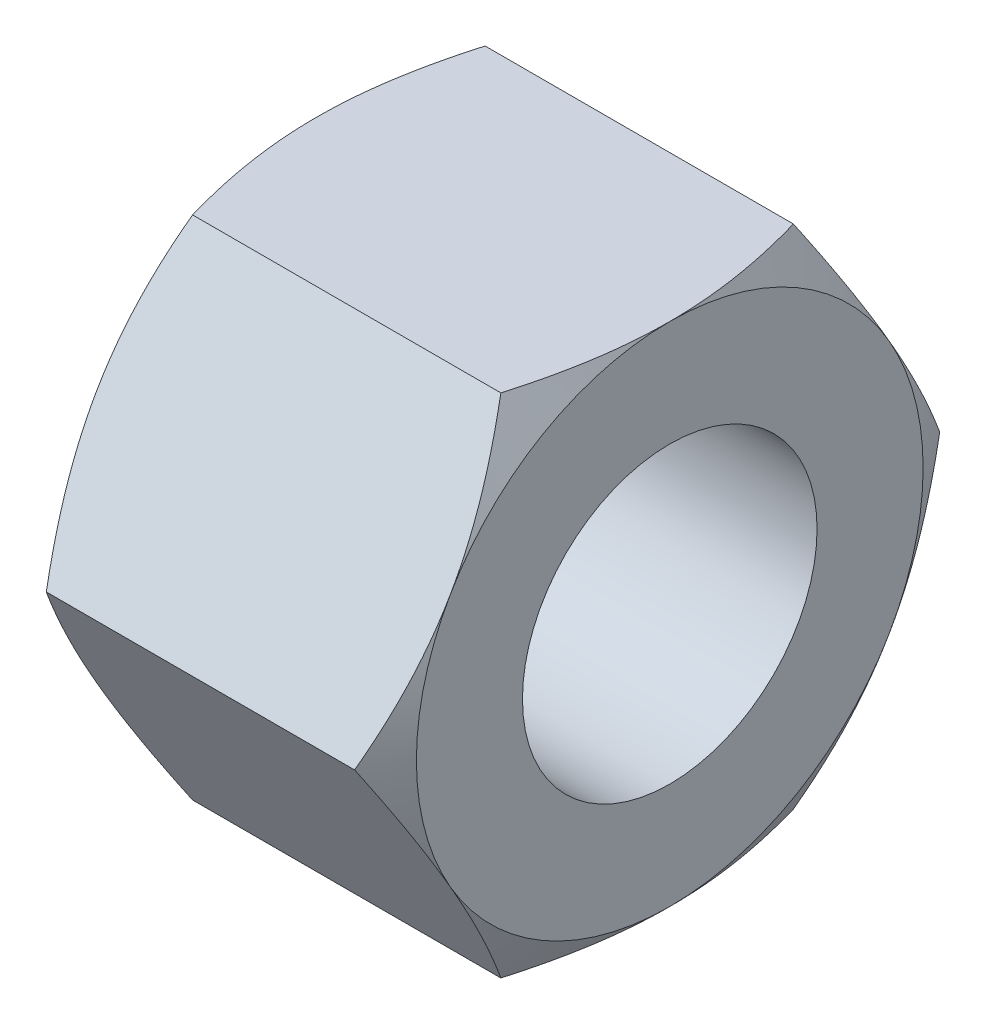
ISO-10303-21;
HEADER;
FILE_DESCRIPTION(('STEP AP214'),'2;1');
FILE_NAME('part.step','',(''),(''),'','','');
FILE_SCHEMA(('AUTOMOTIVE_DESIGN { 1 0 10303 214 1 1 1 1 }'));
ENDSEC;
DATA;
#1=APPLICATION_CONTEXT('core data for automotive mechanical design processes');
#2=APPLICATION_PROTOCOL_DEFINITION('international standard','automotive_design',2000,#1);
#3=PRODUCT_CONTEXT('',#1,'mechanical');
#4=PRODUCT('Part','Part','',(#3));
#5=PRODUCT_RELATED_PRODUCT_CATEGORY('part','',(#4));
#6=PRODUCT_DEFINITION_FORMATION('','',#4);
#7=PRODUCT_DEFINITION_CONTEXT('part definition',#1,'design');
#8=PRODUCT_DEFINITION('design','',#6,#7);
#9=PRODUCT_DEFINITION_SHAPE('','',#8);
#10=(LENGTH_UNIT() NAMED_UNIT(*) SI_UNIT(.MILLI.,.METRE.));
#11=(NAMED_UNIT(*) PLANE_ANGLE_UNIT() SI_UNIT($,.RADIAN.));
#12=(NAMED_UNIT(*) SI_UNIT($,.STERADIAN.) SOLID_ANGLE_UNIT());
#13=UNCERTAINTY_MEASURE_WITH_UNIT(LENGTH_MEASURE(1.E-05),#10,'distance_accuracy_value','');
#14=(GEOMETRIC_REPRESENTATION_CONTEXT(3) GLOBAL_UNCERTAINTY_ASSIGNED_CONTEXT((#13)) GLOBAL_UNIT_ASSIGNED_CONTEXT((#10,
#11,#12)) REPRESENTATION_CONTEXT('',''));
#15=CARTESIAN_POINT('',(0.,0.,0.));
#16=DIRECTION('',(0.,0.,1.));
#17=DIRECTION('',(1.,0.,0.));
#18=AXIS2_PLACEMENT_3D('',#15,#16,#17);
#19=CARTESIAN_POINT('',(3.,-2.14999999999999,-1.24130307875772));
#20=DIRECTION('',(0.,0.499999999999995,0.866025403784441));
#21=DIRECTION('',(0.,-0.866025403784442,0.499999999999995));
#22=AXIS2_PLACEMENT_3D('',#19,#20,#21);
#23=PLANE('',#22);
#24=CARTESIAN_POINT('',(0.192096925893251,0.0002,-2.48272162756923));
#25=CARTESIAN_POINT('',(0.160589161253283,-0.0942828544477714,-2.42817192612001));
#26=CARTESIAN_POINT('',(0.131933662025594,-0.189581276095229,-2.3731513567285));
#27=CARTESIAN_POINT('',(0.0819144293305165,-0.381828422928351,-2.26215741475346));
#28=CARTESIAN_POINT('',(0.0605683921605976,-0.478780564899942,-2.20618206948765));
#29=CARTESIAN_POINT('',(0.0273391201969649,-0.671483268180891,-2.09492511187483));
#30=CARTESIAN_POINT('',(0.0152347449233589,-0.7672041742709,-2.03966062097669));
#31=CARTESIAN_POINT('',(0.000782809472607443,-0.959096546668927,-1.92887150811725));
#32=CARTESIAN_POINT('',(-0.00157671621943161,-1.05526731517428,-1.87334728903251));
#33=CARTESIAN_POINT('',(0.00332342050458356,-1.23497844012888,-1.76959102266361));
#34=CARTESIAN_POINT('',(0.00937993057849274,-1.31854565443535,-1.72134346898834));
#35=CARTESIAN_POINT('',(0.0285781524174342,-1.48513562507559,-1.62516270459491));
#36=CARTESIAN_POINT('',(0.0417264267478165,-1.56815780490605,-1.57722982672108));
#37=CARTESIAN_POINT('',(0.0745971339559549,-1.73509144705124,-1.48085064349176));
#38=CARTESIAN_POINT('',(0.0944589497722667,-1.81898177370144,-1.43241654081785));
#39=CARTESIAN_POINT('',(0.139537859693889,-1.98551098840158,-1.33627085388279));
#40=CARTESIAN_POINT('',(0.164744356993194,-2.06815201109882,-1.28855803718244));
#41=CARTESIAN_POINT('',(0.192096925893251,-2.15019999999999,-1.24118760870388));
#42=B_SPLINE_CURVE_WITH_KNOTS('',3,(#24,#25,#26,#27,#28,#29,#30,#31,#32,#33,#34,#35,#36,#37,#38,
#39,#40,#41),.UNSPECIFIED.,.F.,.F.,(4,2,2,2,2,2,2,2,4),(0.,0.340808025484725,0.682435412466171,
1.01560703788048,1.34836944636288,1.63814855640103,1.92819628298639,2.22467903177776,
2.52057935603964),.UNSPECIFIED.);
#43=CARTESIAN_POINT('',(0.192030254575638,0.,-2.48260615751539));
#44=VERTEX_POINT('',#43);
#45=CARTESIAN_POINT('',(0.,-1.07499999999999,-1.86195461813655));
#46=VERTEX_POINT('',#45);
#47=EDGE_CURVE('E157',#44,#46,#42,.T.);
#48=ORIENTED_EDGE('',*,*,#47,.F.);
#49=DIRECTION('',(-1.,0.,0.));
#50=VECTOR('',#49,1.);
#51=CARTESIAN_POINT('',(3.,0.,-2.48260615751539));
#52=LINE('',#51,#50);
#53=CARTESIAN_POINT('',(2.80796974542436,0.,-2.48260615751539));
#54=VERTEX_POINT('',#53);
#55=EDGE_CURVE('E170',#54,#44,#52,.T.);
#56=ORIENTED_EDGE('',*,*,#55,.F.);
#57=CARTESIAN_POINT('',(2.80790307410675,-2.15019999999999,-1.24118760870388));
#58=CARTESIAN_POINT('',(2.83941083874672,-2.05571714555222,-1.29573731015311));
#59=CARTESIAN_POINT('',(2.86806633797441,-1.96041872390476,-1.35075787954461));
#60=CARTESIAN_POINT('',(2.91808557066948,-1.76817157707164,-1.46175182151965));
#61=CARTESIAN_POINT('',(2.9394316078394,-1.67121943510004,-1.51772716678546));
#62=CARTESIAN_POINT('',(2.97266087980303,-1.4785167318191,-1.62898412439828));
#63=CARTESIAN_POINT('',(2.98476525507664,-1.38279582572909,-1.68424861529642));
#64=CARTESIAN_POINT('',(2.99921719052739,-1.19090345333106,-1.79503772815586));
#65=CARTESIAN_POINT('',(3.00157671621943,-1.0947326848257,-1.8505619472406));
#66=CARTESIAN_POINT('',(2.99667657949542,-0.915021559871109,-1.9543182136095));
#67=CARTESIAN_POINT('',(2.99062006942151,-0.831454345564637,-2.00256576728477));
#68=CARTESIAN_POINT('',(2.97142184758257,-0.664864374924398,-2.0987465316782));
#69=CARTESIAN_POINT('',(2.95827357325218,-0.581842195093935,-2.14667940955203));
#70=CARTESIAN_POINT('',(2.92540286604404,-0.41490855294875,-2.24305859278136));
#71=CARTESIAN_POINT('',(2.90554105022773,-0.331018226298543,-2.29149269545526));
#72=CARTESIAN_POINT('',(2.86046214030611,-0.164489011598404,-2.38763838239032));
#73=CARTESIAN_POINT('',(2.83525564300681,-0.0818479889011668,-2.43535119909067));
#74=CARTESIAN_POINT('',(2.80790307410675,0.000199999999999887,-2.48272162756923));
#75=B_SPLINE_CURVE_WITH_KNOTS('',3,(#57,#58,#59,#60,#61,#62,#63,#64,#65,#66,#67,#68,#69,#70,#71,
#72,#73,#74),.UNSPECIFIED.,.F.,.F.,(4,2,2,2,2,2,2,2,4),(0.,0.340808025484725,0.682435412466171,
1.01560703788048,1.34836944636288,1.63814855640103,1.92819628298639,2.22467903177776,
2.52057935603964),.UNSPECIFIED.);
#76=CARTESIAN_POINT('',(3.,-1.07499999999999,-1.86195461813656));
#77=VERTEX_POINT('',#76);
#78=EDGE_CURVE('E350',#77,#54,#75,.T.);
#79=ORIENTED_EDGE('',*,*,#78,.F.);
#80=CARTESIAN_POINT('',(2.8079697454251,-2.14999999999999,-1.24130307875881));
#81=VERTEX_POINT('',#80);
#82=EDGE_CURVE('E339',#81,#77,#75,.T.);
#83=ORIENTED_EDGE('',*,*,#82,.F.);
#84=DIRECTION('',(-1.,0.,0.));
#85=VECTOR('',#84,1.);
#86=CARTESIAN_POINT('',(3.,-2.14999999999999,-1.24130307875772));
#87=LINE('',#86,#85);
#88=CARTESIAN_POINT('',(0.192030254575638,-2.14999999999999,-1.24130307875772));
#89=VERTEX_POINT('',#88);
#90=EDGE_CURVE('E265',#81,#89,#87,.T.);
#91=ORIENTED_EDGE('',*,*,#90,.T.);
#92=EDGE_CURVE('E223',#46,#89,#42,.T.);
#93=ORIENTED_EDGE('',*,*,#92,.F.);
#94=EDGE_LOOP('',(#48,#56,#79,#83,#91,#93));
#95=FACE_BOUND('',#94,.T.);
#96=ADVANCED_FACE('F47',(#95),#23,.F.);
#97=CARTESIAN_POINT('',(3.,0.,-2.48260615751539));
#98=DIRECTION('',(0.,-0.500000000000001,0.866025403784438));
#99=DIRECTION('',(0.,-0.866025403784438,-0.500000000000001));
#100=AXIS2_PLACEMENT_3D('',#97,#98,#99);
#101=PLANE('',#100);
#102=CARTESIAN_POINT('',(0.192096925893251,2.1502,-1.24118760870385));
#103=CARTESIAN_POINT('',(0.160589161253282,2.05571714555223,-1.29573731015308));
#104=CARTESIAN_POINT('',(0.131933662025594,1.96041872390478,-1.35075787954458));
#105=CARTESIAN_POINT('',(0.0819144293305153,1.76817157707166,-1.46175182151962));
#106=CARTESIAN_POINT('',(0.060568392160596,1.67121943510006,-1.51772716678543));
#107=CARTESIAN_POINT('',(0.0273391201969623,1.47851673181912,-1.62898412439826));
#108=CARTESIAN_POINT('',(0.0152347449233555,1.38279582572911,-1.6842486152964));
#109=CARTESIAN_POINT('',(0.000782809472603016,1.19090345333108,-1.79503772815584));
#110=CARTESIAN_POINT('',(-0.00157671621943646,1.09473268482573,-1.85056194724058));
#111=CARTESIAN_POINT('',(0.003323420504578,0.91502155987113,-1.95431821360948));
#112=CARTESIAN_POINT('',(0.00937993057848707,0.831454345564656,-2.00256576728475));
#113=CARTESIAN_POINT('',(0.0285781524174287,0.664864374924414,-2.09874653167819));
#114=CARTESIAN_POINT('',(0.0417264267478113,0.581842195093949,-2.14667940955202));
#115=CARTESIAN_POINT('',(0.0745971339559506,0.41490855294876,-2.24305859278135));
#116=CARTESIAN_POINT('',(0.094458949772263,0.33101822629855,-2.29149269545525));
#117=CARTESIAN_POINT('',(0.139537859693887,0.164489011598408,-2.38763838239032));
#118=CARTESIAN_POINT('',(0.164744356993193,0.0818479889011682,-2.43535119909067));
#119=CARTESIAN_POINT('',(0.192096925893251,-0.00020000000000019,-2.48272162756923));
#120=B_SPLINE_CURVE_WITH_KNOTS('',3,(#102,#103,#104,#105,#106,#107,#108,#109,#110,#111,#112,
#113,#114,#115,#116,#117,#118,#119),.UNSPECIFIED.,.F.,.F.,(4,2,2,2,2,2,2,2,4),(0.,
0.340808025484724,0.682435412466171,1.01560703788048,1.34836944636288,1.63814855640104,
1.92819628298641,2.22467903177778,2.52057935603967),.UNSPECIFIED.);
#121=CARTESIAN_POINT('',(0.192030254575638,2.15,-1.24130307875769));
#122=VERTEX_POINT('',#121);
#123=CARTESIAN_POINT('',(0.,1.075,-1.86195461813654));
#124=VERTEX_POINT('',#123);
#125=EDGE_CURVE('E137',#122,#124,#120,.T.);
#126=ORIENTED_EDGE('',*,*,#125,.F.);
#127=DIRECTION('',(-1.,0.,0.));
#128=VECTOR('',#127,1.);
#129=CARTESIAN_POINT('',(3.,2.15,-1.24130307875769));
#130=LINE('',#129,#128);
#131=CARTESIAN_POINT('',(2.80796974542436,2.15,-1.24130307875769));
#132=VERTEX_POINT('',#131);
#133=EDGE_CURVE('E262',#132,#122,#130,.T.);
#134=ORIENTED_EDGE('',*,*,#133,.F.);
#135=CARTESIAN_POINT('',(2.80790307410675,-0.000200000000000046,-2.48272162756923));
#136=CARTESIAN_POINT('',(2.83941083874672,0.0942828544477709,-2.42817192612001));
#137=CARTESIAN_POINT('',(2.86806633797441,0.189581276095228,-2.3731513567285));
#138=CARTESIAN_POINT('',(2.91808557066948,0.381828422928349,-2.26215741475346));
#139=CARTESIAN_POINT('',(2.9394316078394,0.478780564899939,-2.20618206948765));
#140=CARTESIAN_POINT('',(2.97266087980304,0.671483268180888,-2.09492511187483));
#141=CARTESIAN_POINT('',(2.98476525507664,0.767204174270896,-2.03966062097669));
#142=CARTESIAN_POINT('',(2.9992171905274,0.959096546668922,-1.92887150811725));
#143=CARTESIAN_POINT('',(3.00157671621944,1.05526731517428,-1.87334728903251));
#144=CARTESIAN_POINT('',(2.99667657949542,1.23497844012887,-1.7695910226636));
#145=CARTESIAN_POINT('',(2.99062006942151,1.31854565443535,-1.72134346898833));
#146=CARTESIAN_POINT('',(2.97142184758257,1.48513562507559,-1.6251627045949));
#147=CARTESIAN_POINT('',(2.95827357325219,1.56815780490606,-1.57722982672107));
#148=CARTESIAN_POINT('',(2.92540286604405,1.73509144705124,-1.48085064349174));
#149=CARTESIAN_POINT('',(2.90554105022774,1.81898177370145,-1.43241654081783));
#150=CARTESIAN_POINT('',(2.86046214030611,1.9855109884016,-1.33627085388277));
#151=CARTESIAN_POINT('',(2.83525564300681,2.06815201109884,-1.28855803718241));
#152=CARTESIAN_POINT('',(2.80790307410675,2.1502,-1.24118760870385));
#153=B_SPLINE_CURVE_WITH_KNOTS('',3,(#135,#136,#137,#138,#139,#140,#141,#142,#143,#144,#145,
#146,#147,#148,#149,#150,#151,#152),.UNSPECIFIED.,.F.,.F.,(4,2,2,2,2,2,2,2,4),(0.,
0.340808025484724,0.682435412466171,1.01560703788048,1.34836944636288,1.63814855640104,
1.92819628298641,2.22467903177778,2.52057935603967),.UNSPECIFIED.);
#154=CARTESIAN_POINT('',(3.,1.075,-1.86195461813654));
#155=VERTEX_POINT('',#154);
#156=EDGE_CURVE('E314',#155,#132,#153,.T.);
#157=ORIENTED_EDGE('',*,*,#156,.F.);
#158=EDGE_CURVE('E356',#54,#155,#153,.T.);
#159=ORIENTED_EDGE('',*,*,#158,.F.);
#160=ORIENTED_EDGE('',*,*,#55,.T.);
#161=EDGE_CURVE('E150',#124,#44,#120,.T.);
#162=ORIENTED_EDGE('',*,*,#161,.F.);
#163=EDGE_LOOP('',(#126,#134,#157,#159,#160,#162));
#164=FACE_BOUND('',#163,.T.);
#165=ADVANCED_FACE('F167',(#164),#101,.F.);
#166=CARTESIAN_POINT('',(3.,2.15,-1.24130307875769));
#167=DIRECTION('',(0.,-1.,0.));
#168=DIRECTION('',(0.,0.,-1.));
#169=AXIS2_PLACEMENT_3D('',#166,#167,#168);
#170=PLANE('',#169);
#171=CARTESIAN_POINT('',(1.97304082720904,2.14999999999998,5.13551557659761));
#172=CARTESIAN_POINT('',(1.9111978136608,2.14999999999998,5.01938751978212));
#173=CARTESIAN_POINT('',(1.84959388661399,2.14999999999998,4.90313272305725));
#174=CARTESIAN_POINT('',(1.72697575970478,2.14999999999998,4.67031149862428));
#175=CARTESIAN_POINT('',(1.665961564463,2.14999999999999,4.55374506848361));
#176=CARTESIAN_POINT('',(1.48384103932484,2.14999999999999,4.20324109640305));
#177=CARTESIAN_POINT('',(1.36379113122948,2.14999999999999,3.96875001202137));
#178=CARTESIAN_POINT('',(1.18383705796109,2.14999999999999,3.60904411221717));
#179=CARTESIAN_POINT('',(1.12235080546833,2.14999999999999,3.48462136005536));
#180=CARTESIAN_POINT('',(1.00096010135083,2.14999999999999,3.23500779711982));
#181=CARTESIAN_POINT('',(0.94105561419551,2.14999999999999,3.10981700367628));
#182=CARTESIAN_POINT('',(0.823335394707892,2.14999999999999,2.8585123096818));
#183=CARTESIAN_POINT('',(0.765518864800745,2.14999999999999,2.73239878422348));
#184=CARTESIAN_POINT('',(0.65264891502778,2.14999999999999,2.47894575735579));
#185=CARTESIAN_POINT('',(0.59759529935055,2.14999999999999,2.35160634359126));
#186=CARTESIAN_POINT('',(0.487153640528622,2.14999999999999,2.08552303397737));
#187=CARTESIAN_POINT('',(0.432064246359885,2.14999999999999,1.94665396448609));
#188=CARTESIAN_POINT('',(0.328060373356721,2.14999999999999,1.66664213248608));
#189=CARTESIAN_POINT('',(0.279143728185996,2.15,1.525500187366));
#190=CARTESIAN_POINT('',(0.190945483914671,2.15,1.2431159149578));
#191=CARTESIAN_POINT('',(0.15149868699877,2.15,1.10192630034479));
#192=CARTESIAN_POINT('',(0.084428327339249,2.15,0.816736754408399));
#193=CARTESIAN_POINT('',(0.0567981354084033,2.15,0.672738446317868));
#194=CARTESIAN_POINT('',(0.020463826511873,2.15,0.408660935346112));
#195=CARTESIAN_POINT('',(0.00925034624987716,2.15,0.288935284342623));
#196=CARTESIAN_POINT('',(-0.00159607014466984,2.15,0.0489864519840883));
#197=CARTESIAN_POINT('',(-0.00123341990284286,2.15,-0.0712365222763948));
#198=CARTESIAN_POINT('',(0.0111353515090182,2.15,-0.313204147053768));
#199=CARTESIAN_POINT('',(0.0233471789357867,2.15,-0.434938129891304));
#200=CARTESIAN_POINT('',(0.0495535256709606,2.15,-0.616352834193735));
#201=CARTESIAN_POINT('',(0.059607204159289,2.15,-0.676641450244351));
#202=CARTESIAN_POINT('',(0.0820923756868423,2.15,-0.79677017282907));
#203=CARTESIAN_POINT('',(0.0945237298383461,2.15,-0.85661030534848));
#204=CARTESIAN_POINT('',(0.15188984717885,2.15,-1.11011970307587));
#205=CARTESIAN_POINT('',(0.206947346628562,2.15,-1.30152357480082));
#206=CARTESIAN_POINT('',(0.300208918417984,2.15000000000001,-1.58501790053871));
#207=CARTESIAN_POINT('',(0.333108416249079,2.15000000000001,-1.67899380667504));
#208=CARTESIAN_POINT('',(0.40175338877044,2.15000000000001,-1.86590397338936));
#209=CARTESIAN_POINT('',(0.437498578956992,2.15000000000001,-1.9588383370405));
#210=CARTESIAN_POINT('',(0.548535557445448,2.15000000000001,-2.23748204208735));
#211=CARTESIAN_POINT('',(0.627215911804394,2.15000000000001,-2.42183067735492));
#212=CARTESIAN_POINT('',(0.790205035173104,2.15000000000001,-2.78783671960571));
#213=CARTESIAN_POINT('',(0.874510108907902,2.15000000000001,-2.96949579952417));
#214=CARTESIAN_POINT('',(1.04120457427137,2.15000000000001,-3.31904360015749));
#215=CARTESIAN_POINT('',(1.12335181593812,2.15000000000001,-3.48704835746746));
#216=CARTESIAN_POINT('',(1.28999448343906,2.15000000000001,-3.82192225231572));
#217=CARTESIAN_POINT('',(1.37449032930706,2.15000000000001,-3.98879117998764));
#218=CARTESIAN_POINT('',(1.54398995280402,2.15000000000001,-4.31934969091627));
#219=CARTESIAN_POINT('',(1.62897041638622,2.15000000000002,-4.48305126284176));
#220=CARTESIAN_POINT('',(1.80016880116636,2.15000000000002,-4.80975241634022));
#221=CARTESIAN_POINT('',(1.88638639478245,2.15000000000002,-4.97275216941171));
#222=CARTESIAN_POINT('',(1.97304082720904,2.15000000000002,-5.13551557659759));
#223=B_SPLINE_CURVE_WITH_KNOTS('',3,(#171,#172,#173,#174,#175,#176,#177,#178,#179,#180,#181,
#182,#183,#184,#185,#186,#187,#188,#189,#190,#191,#192,#193,#194,#195,#196,#197,#198,#199,#200,
#201,#202,#203,#204,#205,#206,#207,#208,#209,#210,#211,#212,#213,#214,#215,#216,#217,#218,#219,
#220,#221,#222),.UNSPECIFIED.,.F.,.F.,(4,2,2,2,2,2,2,2,2,2,2,2,2,2,2,2,2,2,2,2,2,2,2,2,2,4),(0.,
0.394704010920265,0.789411111892057,1.57967974830859,1.99603001095195,2.41237091331258,
2.8285510589567,3.24470166758592,3.69279283627303,4.14072630667059,4.58016108683166,
5.01934901699028,5.37958634547043,5.73968632808142,6.10615173432806,6.28947511358881,
6.47278778760703,7.06914896413799,7.36784667976661,7.6665145699135,8.26765607337328,
8.86840646110641,9.42941927258817,9.99053307175602,10.5438614714433,11.0970459633543),.UNSPECIFIED.);
#224=CARTESIAN_POINT('',(0.192030254575638,2.15,1.24130307875771));
#225=VERTEX_POINT('',#224);
#226=CARTESIAN_POINT('',(0.,2.15,0.));
#227=VERTEX_POINT('',#226);
#228=EDGE_CURVE('E64',#225,#227,#223,.T.);
#229=ORIENTED_EDGE('',*,*,#228,.F.);
#230=DIRECTION('',(-1.,0.,0.));
#231=VECTOR('',#230,1.);
#232=CARTESIAN_POINT('',(3.,2.15,1.24130307875771));
#233=LINE('',#232,#231);
#234=CARTESIAN_POINT('',(2.80796974542436,2.15,1.24130307875771));
#235=VERTEX_POINT('',#234);
#236=EDGE_CURVE('E257',#235,#225,#233,.T.);
#237=ORIENTED_EDGE('',*,*,#236,.F.);
#238=CARTESIAN_POINT('',(1.02695917279096,2.15000000000002,-5.1355155765976));
#239=CARTESIAN_POINT('',(1.0888021863392,2.15000000000002,-5.0193875197821));
#240=CARTESIAN_POINT('',(1.15040611338601,2.15000000000002,-4.90313272305724));
#241=CARTESIAN_POINT('',(1.27302424029522,2.15000000000002,-4.67031149862427));
#242=CARTESIAN_POINT('',(1.334038435537,2.15000000000002,-4.5537450684836));
#243=CARTESIAN_POINT('',(1.51615896067516,2.15000000000001,-4.20324109640304));
#244=CARTESIAN_POINT('',(1.63620886877052,2.15000000000001,-3.96875001202136));
#245=CARTESIAN_POINT('',(1.81616294203891,2.15000000000001,-3.60904411221715));
#246=CARTESIAN_POINT('',(1.87764919453167,2.15000000000001,-3.48462136005535));
#247=CARTESIAN_POINT('',(1.99903989864917,2.15000000000001,-3.23500779711981));
#248=CARTESIAN_POINT('',(2.05894438580449,2.15000000000001,-3.10981700367626));
#249=CARTESIAN_POINT('',(2.17666460529211,2.15000000000001,-2.85851230968179));
#250=CARTESIAN_POINT('',(2.23448113519926,2.15000000000001,-2.73239878422347));
#251=CARTESIAN_POINT('',(2.34735108497222,2.15000000000001,-2.47894575735578));
#252=CARTESIAN_POINT('',(2.40240470064945,2.15000000000001,-2.35160634359125));
#253=CARTESIAN_POINT('',(2.51284635947138,2.15000000000001,-2.08552303397735));
#254=CARTESIAN_POINT('',(2.56793575364012,2.15000000000001,-1.94665396448607));
#255=CARTESIAN_POINT('',(2.67193962664328,2.15000000000001,-1.66664213248606));
#256=CARTESIAN_POINT('',(2.720856271814,2.15000000000001,-1.52550018736599));
#257=CARTESIAN_POINT('',(2.80905451608533,2.15,-1.24311591495779));
#258=CARTESIAN_POINT('',(2.84850131300123,2.15,-1.10192630034477));
#259=CARTESIAN_POINT('',(2.91557167266075,2.15,-0.816736754408384));
#260=CARTESIAN_POINT('',(2.9432018645916,2.15,-0.672738446317853));
#261=CARTESIAN_POINT('',(2.97953617348813,2.15,-0.408660935346099));
#262=CARTESIAN_POINT('',(2.99074965375012,2.15,-0.28893528434261));
#263=CARTESIAN_POINT('',(3.00159607014467,2.15,-0.048986451984075));
#264=CARTESIAN_POINT('',(3.00123341990284,2.15,0.0712365222764083));
#265=CARTESIAN_POINT('',(2.98886464849098,2.15,0.313204147053782));
#266=CARTESIAN_POINT('',(2.97665282106421,2.15,0.434938129891318));
#267=CARTESIAN_POINT('',(2.95044647432904,2.15,0.616352834193748));
#268=CARTESIAN_POINT('',(2.94039279584071,2.15,0.676641450244365));
#269=CARTESIAN_POINT('',(2.91790762431316,2.15,0.796770172829084));
#270=CARTESIAN_POINT('',(2.90547627016165,2.15,0.856610305348494));
#271=CARTESIAN_POINT('',(2.84811015282115,2.15,1.11011970307588));
#272=CARTESIAN_POINT('',(2.79305265337144,2.15,1.30152357480084));
#273=CARTESIAN_POINT('',(2.69979108158202,2.14999999999999,1.58501790053873));
#274=CARTESIAN_POINT('',(2.66689158375092,2.14999999999999,1.67899380667505));
#275=CARTESIAN_POINT('',(2.59824661122956,2.14999999999999,1.86590397338938));
#276=CARTESIAN_POINT('',(2.56250142104301,2.14999999999999,1.95883833704051));
#277=CARTESIAN_POINT('',(2.45146444255455,2.14999999999999,2.23748204208736));
#278=CARTESIAN_POINT('',(2.37278408819561,2.14999999999999,2.42183067735494));
#279=CARTESIAN_POINT('',(2.2097949648269,2.14999999999999,2.78783671960573));
#280=CARTESIAN_POINT('',(2.1254898910921,2.14999999999999,2.96949579952418));
#281=CARTESIAN_POINT('',(1.95879542572863,2.14999999999999,3.3190436001575));
#282=CARTESIAN_POINT('',(1.87664818406188,2.14999999999999,3.48704835746747));
#283=CARTESIAN_POINT('',(1.71000551656094,2.14999999999999,3.82192225231574));
#284=CARTESIAN_POINT('',(1.62550967069295,2.14999999999999,3.98879117998765));
#285=CARTESIAN_POINT('',(1.45601004719598,2.14999999999999,4.31934969091628));
#286=CARTESIAN_POINT('',(1.37102958361378,2.14999999999999,4.48305126284177));
#287=CARTESIAN_POINT('',(1.19983119883364,2.14999999999998,4.80975241634023));
#288=CARTESIAN_POINT('',(1.11361360521755,2.14999999999998,4.97275216941173));
#289=CARTESIAN_POINT('',(1.02695917279096,2.14999999999998,5.13551557659761));
#290=B_SPLINE_CURVE_WITH_KNOTS('',3,(#238,#239,#240,#241,#242,#243,#244,#245,#246,#247,#248,
#249,#250,#251,#252,#253,#254,#255,#256,#257,#258,#259,#260,#261,#262,#263,#264,#265,#266,#267,
#268,#269,#270,#271,#272,#273,#274,#275,#276,#277,#278,#279,#280,#281,#282,#283,#284,#285,#286,
#287,#288,#289),.UNSPECIFIED.,.F.,.F.,(4,2,2,2,2,2,2,2,2,2,2,2,2,2,2,2,2,2,2,2,2,2,2,2,2,4),(0.,
0.394704010920265,0.789411111892056,1.57967974830859,1.99603001095195,2.41237091331258,
2.8285510589567,3.24470166758592,3.69279283627303,4.14072630667059,4.58016108683166,
5.01934901699028,5.37958634547043,5.73968632808142,6.10615173432806,6.28947511358881,
6.47278778760703,7.06914896413799,7.36784667976661,7.6665145699135,8.26765607337328,
8.86840646110641,9.42941927258817,9.99053307175602,10.5438614714433,11.0970459633543),.UNSPECIFIED.);
#291=CARTESIAN_POINT('',(3.,2.15,0.));
#292=VERTEX_POINT('',#291);
#293=EDGE_CURVE('E306',#292,#235,#290,.T.);
#294=ORIENTED_EDGE('',*,*,#293,.F.);
#295=EDGE_CURVE('E313',#132,#292,#290,.T.);
#296=ORIENTED_EDGE('',*,*,#295,.F.);
#297=ORIENTED_EDGE('',*,*,#133,.T.);
#298=EDGE_CURVE('E143',#227,#122,#223,.T.);
#299=ORIENTED_EDGE('',*,*,#298,.F.);
#300=EDGE_LOOP('',(#229,#237,#294,#296,#297,#299));
#301=FACE_BOUND('',#300,.T.);
#302=ADVANCED_FACE('F320',(#301),#170,.F.);
#303=CARTESIAN_POINT('',(3.,2.15,1.24130307875771));
#304=DIRECTION('',(0.,-0.499999999999995,-0.866025403784441));
#305=DIRECTION('',(0.,0.866025403784442,-0.499999999999995));
#306=AXIS2_PLACEMENT_3D('',#303,#304,#305);
#307=PLANE('',#306);
#308=CARTESIAN_POINT('',(0.192096925893251,-0.000200000000017231,2.48272162756923));
#309=CARTESIAN_POINT('',(0.160589161253282,0.0942828544477541,2.42817192612001));
#310=CARTESIAN_POINT('',(0.131933662025594,0.189581276095212,2.3731513567285));
#311=CARTESIAN_POINT('',(0.0819144293305148,0.381828422928333,2.26215741475346));
#312=CARTESIAN_POINT('',(0.0605683921605954,0.478780564899924,2.20618206948765));
#313=CARTESIAN_POINT('',(0.0273391201969618,0.671483268180873,2.09492511187483));
#314=CARTESIAN_POINT('',(0.0152347449233553,0.767204174270882,2.03966062097669));
#315=CARTESIAN_POINT('',(0.000782809472602992,0.959096546668909,1.92887150811725));
#316=CARTESIAN_POINT('',(-0.00157671621943652,1.05526731517427,1.87334728903251));
#317=CARTESIAN_POINT('',(0.00332342050457783,1.23497844012886,1.76959102266361));
#318=CARTESIAN_POINT('',(0.00937993057848684,1.31854565443534,1.72134346898834));
#319=CARTESIAN_POINT('',(0.0285781524174284,1.48513562507558,1.62516270459491));
#320=CARTESIAN_POINT('',(0.0417264267478111,1.56815780490604,1.57722982672108));
#321=CARTESIAN_POINT('',(0.0745971339559505,1.73509144705123,1.48085064349175));
#322=CARTESIAN_POINT('',(0.0944589497722629,1.81898177370144,1.43241654081785));
#323=CARTESIAN_POINT('',(0.139537859693887,1.98551098840159,1.33627085388278));
#324=CARTESIAN_POINT('',(0.164744356993192,2.06815201109883,1.28855803718243));
#325=CARTESIAN_POINT('',(0.192096925893251,2.1502,1.24118760870387));
#326=B_SPLINE_CURVE_WITH_KNOTS('',3,(#308,#309,#310,#311,#312,#313,#314,#315,#316,#317,#318,
#319,#320,#321,#322,#323,#324,#325),.UNSPECIFIED.,.F.,.F.,(4,2,2,2,2,2,2,2,4),(0.,
0.340808025484724,0.682435412466171,1.01560703788048,1.34836944636288,1.63814855640104,
1.92819628298641,2.22467903177778,2.52057935603967),.UNSPECIFIED.);
#327=CARTESIAN_POINT('',(0.192030254575638,0.,2.48260615751539));
#328=VERTEX_POINT('',#327);
#329=CARTESIAN_POINT('',(0.,1.07499999999999,1.86195461813655));
#330=VERTEX_POINT('',#329);
#331=EDGE_CURVE('E71',#328,#330,#326,.T.);
#332=ORIENTED_EDGE('',*,*,#331,.F.);
#333=DIRECTION('',(-1.,0.,0.));
#334=VECTOR('',#333,1.);
#335=CARTESIAN_POINT('',(3.,0.,2.48260615751539));
#336=LINE('',#335,#334);
#337=CARTESIAN_POINT('',(2.80796974542436,0.,2.48260615751539));
#338=VERTEX_POINT('',#337);
#339=EDGE_CURVE('E249',#338,#328,#336,.T.);
#340=ORIENTED_EDGE('',*,*,#339,.F.);
#341=CARTESIAN_POINT('',(2.80790307410675,2.1502,1.24118760870387));
#342=CARTESIAN_POINT('',(2.83941083874672,2.05571714555222,1.29573731015309));
#343=CARTESIAN_POINT('',(2.86806633797441,1.96041872390477,1.3507578795446));
#344=CARTESIAN_POINT('',(2.91808557066948,1.76817157707165,1.46175182151964));
#345=CARTESIAN_POINT('',(2.9394316078394,1.67121943510005,1.51772716678544));
#346=CARTESIAN_POINT('',(2.97266087980304,1.47851673181911,1.62898412439827));
#347=CARTESIAN_POINT('',(2.98476525507664,1.3827958257291,1.68424861529641));
#348=CARTESIAN_POINT('',(2.9992171905274,1.19090345333107,1.79503772815584));
#349=CARTESIAN_POINT('',(3.00157671621944,1.09473268482571,1.85056194724058));
#350=CARTESIAN_POINT('',(2.99667657949542,0.915021559871117,1.95431821360949));
#351=CARTESIAN_POINT('',(2.99062006942151,0.831454345564642,2.00256576728476));
#352=CARTESIAN_POINT('',(2.97142184758257,0.664864374924399,2.09874653167819));
#353=CARTESIAN_POINT('',(2.95827357325219,0.581842195093934,2.14667940955202));
#354=CARTESIAN_POINT('',(2.92540286604405,0.414908552948745,2.24305859278135));
#355=CARTESIAN_POINT('',(2.90554105022774,0.331018226298535,2.29149269545525));
#356=CARTESIAN_POINT('',(2.86046214030611,0.164489011598392,2.38763838239032));
#357=CARTESIAN_POINT('',(2.83525564300681,0.0818479889011517,2.43535119909067));
#358=CARTESIAN_POINT('',(2.80790307410675,-0.000200000000017105,2.48272162756923));
#359=B_SPLINE_CURVE_WITH_KNOTS('',3,(#341,#342,#343,#344,#345,#346,#347,#348,#349,#350,#351,
#352,#353,#354,#355,#356,#357,#358),.UNSPECIFIED.,.F.,.F.,(4,2,2,2,2,2,2,2,4),(0.,
0.340808025484725,0.682435412466171,1.01560703788048,1.34836944636288,1.63814855640104,
1.92819628298641,2.22467903177778,2.52057935603967),.UNSPECIFIED.);
#360=CARTESIAN_POINT('',(3.,1.07499999999999,1.86195461813655));
#361=VERTEX_POINT('',#360);
#362=EDGE_CURVE('E298',#361,#338,#359,.T.);
#363=ORIENTED_EDGE('',*,*,#362,.F.);
#364=EDGE_CURVE('E305',#235,#361,#359,.T.);
#365=ORIENTED_EDGE('',*,*,#364,.F.);
#366=ORIENTED_EDGE('',*,*,#236,.T.);
#367=EDGE_CURVE('E149',#330,#225,#326,.T.);
#368=ORIENTED_EDGE('',*,*,#367,.F.);
#369=EDGE_LOOP('',(#332,#340,#363,#365,#366,#368));
#370=FACE_BOUND('',#369,.T.);
#371=ADVANCED_FACE('F247',(#370),#307,.F.);
#372=CARTESIAN_POINT('',(3.,0.,2.48260615751539));
#373=DIRECTION('',(0.,0.500000000000007,-0.866025403784435));
#374=DIRECTION('',(0.,0.866025403784434,0.500000000000007));
#375=AXIS2_PLACEMENT_3D('',#372,#373,#374);
#376=PLANE('',#375);
#377=CARTESIAN_POINT('',(0.192096925893251,-2.15020000000001,1.24118760870384));
#378=CARTESIAN_POINT('',(0.160589161253282,-2.05571714555224,1.29573731015306));
#379=CARTESIAN_POINT('',(0.131933662025594,-1.96041872390479,1.35075787954457));
#380=CARTESIAN_POINT('',(0.0819144293305151,-1.76817157707167,1.46175182151961));
#381=CARTESIAN_POINT('',(0.0605683921605958,-1.67121943510008,1.51772716678542));
#382=CARTESIAN_POINT('',(0.027339120196962,-1.47851673181913,1.62898412439825));
#383=CARTESIAN_POINT('',(0.0152347449233554,-1.38279582572912,1.68424861529639));
#384=CARTESIAN_POINT('',(0.000782809472602893,-1.19090345333109,1.79503772815583));
#385=CARTESIAN_POINT('',(-0.00157671621943667,-1.09473268482574,1.85056194724057));
#386=CARTESIAN_POINT('',(0.00332342050457772,-0.915021559871144,1.95431821360948));
#387=CARTESIAN_POINT('',(0.00937993057848679,-0.83145434556467,2.00256576728475));
#388=CARTESIAN_POINT('',(0.0285781524174284,-0.664864374924429,2.09874653167818));
#389=CARTESIAN_POINT('',(0.041726426747811,-0.581842195093964,2.14667940955201));
#390=CARTESIAN_POINT('',(0.0745971339559504,-0.414908552948775,2.24305859278134));
#391=CARTESIAN_POINT('',(0.0944589497722629,-0.331018226298566,2.29149269545525));
#392=CARTESIAN_POINT('',(0.139537859693887,-0.164489011598424,2.38763838239031));
#393=CARTESIAN_POINT('',(0.164744356993192,-0.081847988901185,2.43535119909067));
#394=CARTESIAN_POINT('',(0.192096925893251,0.000199999999982735,2.48272162756923));
#395=B_SPLINE_CURVE_WITH_KNOTS('',3,(#377,#378,#379,#380,#381,#382,#383,#384,#385,#386,#387,
#388,#389,#390,#391,#392,#393,#394),.UNSPECIFIED.,.F.,.F.,(4,2,2,2,2,2,2,2,4),(0.,
0.340808025484724,0.682435412466171,1.01560703788048,1.34836944636288,1.63814855640104,
1.92819628298641,2.22467903177778,2.52057935603967),.UNSPECIFIED.);
#396=CARTESIAN_POINT('',(0.192030254574899,-2.15000000000001,1.24130307875877));
#397=VERTEX_POINT('',#396);
#398=CARTESIAN_POINT('',(0.,-1.07500000000002,1.86195461813653));
#399=VERTEX_POINT('',#398);
#400=EDGE_CURVE('E217',#397,#399,#395,.T.);
#401=ORIENTED_EDGE('',*,*,#400,.F.);
#402=DIRECTION('',(-1.,0.,0.));
#403=VECTOR('',#402,1.);
#404=CARTESIAN_POINT('',(3.,-2.15000000000001,1.24130307875768));
#405=LINE('',#404,#403);
#406=CARTESIAN_POINT('',(2.80796974542436,-2.15000000000001,1.24130307875768));
#407=VERTEX_POINT('',#406);
#408=EDGE_CURVE('E258',#407,#397,#405,.T.);
#409=ORIENTED_EDGE('',*,*,#408,.F.);
#410=CARTESIAN_POINT('',(2.80790307410675,0.000199999999982665,2.48272162756923));
#411=CARTESIAN_POINT('',(2.83941083874672,-0.0942828544477879,2.42817192612));
#412=CARTESIAN_POINT('',(2.86806633797441,-0.189581276095244,2.3731513567285));
#413=CARTESIAN_POINT('',(2.91808557066949,-0.381828422928364,2.26215741475346));
#414=CARTESIAN_POINT('',(2.9394316078394,-0.478780564899955,2.20618206948765));
#415=CARTESIAN_POINT('',(2.97266087980304,-0.671483268180902,2.09492511187482));
#416=CARTESIAN_POINT('',(2.98476525507664,-0.76720417427091,2.03966062097668));
#417=CARTESIAN_POINT('',(2.9992171905274,-0.959096546668936,1.92887150811724));
#418=CARTESIAN_POINT('',(3.00157671621944,-1.05526731517429,1.8733472890325));
#419=CARTESIAN_POINT('',(2.99667657949542,-1.23497844012889,1.76959102266359));
#420=CARTESIAN_POINT('',(2.99062006942151,-1.31854565443536,1.72134346898832));
#421=CARTESIAN_POINT('',(2.97142184758257,-1.4851356250756,1.62516270459488));
#422=CARTESIAN_POINT('',(2.95827357325219,-1.56815780490607,1.57722982672106));
#423=CARTESIAN_POINT('',(2.92540286604405,-1.73509144705125,1.48085064349172));
#424=CARTESIAN_POINT('',(2.90554105022774,-1.81898177370146,1.43241654081782));
#425=CARTESIAN_POINT('',(2.86046214030611,-1.98551098840161,1.33627085388275));
#426=CARTESIAN_POINT('',(2.83525564300681,-2.06815201109884,1.2885580371824));
#427=CARTESIAN_POINT('',(2.80790307410675,-2.15020000000001,1.24118760870384));
#428=B_SPLINE_CURVE_WITH_KNOTS('',3,(#410,#411,#412,#413,#414,#415,#416,#417,#418,#419,#420,
#421,#422,#423,#424,#425,#426,#427),.UNSPECIFIED.,.F.,.F.,(4,2,2,2,2,2,2,2,4),(0.,
0.340808025484724,0.682435412466171,1.01560703788048,1.34836944636288,1.63814855640104,
1.92819628298641,2.22467903177778,2.52057935603967),.UNSPECIFIED.);
#429=CARTESIAN_POINT('',(3.,-1.07500000000001,1.86195461813653));
#430=VERTEX_POINT('',#429);
#431=EDGE_CURVE('E290',#430,#407,#428,.T.);
#432=ORIENTED_EDGE('',*,*,#431,.F.);
#433=EDGE_CURVE('E255',#338,#430,#428,.T.);
#434=ORIENTED_EDGE('',*,*,#433,.F.);
#435=ORIENTED_EDGE('',*,*,#339,.T.);
#436=EDGE_CURVE('E173',#399,#328,#395,.T.);
#437=ORIENTED_EDGE('',*,*,#436,.F.);
#438=EDGE_LOOP('',(#401,#409,#432,#434,#435,#437));
#439=FACE_BOUND('',#438,.T.);
#440=ADVANCED_FACE('F252',(#439),#376,.F.);
#441=CARTESIAN_POINT('',(3.,-2.15000000000001,1.24130307875768));
#442=DIRECTION('',(0.,1.,0.));
#443=DIRECTION('',(0.,0.,1.));
#444=AXIS2_PLACEMENT_3D('',#441,#442,#443);
#445=PLANE('',#444);
#446=CARTESIAN_POINT('',(1.97304082720904,-2.14999999999995,-5.13551557659762));
#447=CARTESIAN_POINT('',(1.9111978136608,-2.14999999999995,-5.01938751978213));
#448=CARTESIAN_POINT('',(1.84959388661399,-2.14999999999995,-4.90313272305726));
#449=CARTESIAN_POINT('',(1.72697575970478,-2.14999999999995,-4.67031149862429));
#450=CARTESIAN_POINT('',(1.665961564463,-2.14999999999995,-4.55374506848363));
#451=CARTESIAN_POINT('',(1.48384103932484,-2.14999999999996,-4.20324109640307));
#452=CARTESIAN_POINT('',(1.36379113122948,-2.14999999999996,-3.96875001202138));
#453=CARTESIAN_POINT('',(1.18383705796109,-2.14999999999996,-3.60904411221718));
#454=CARTESIAN_POINT('',(1.12235080546833,-2.14999999999996,-3.48462136005537));
#455=CARTESIAN_POINT('',(1.00096010135083,-2.14999999999997,-3.23500779711983));
#456=CARTESIAN_POINT('',(0.941055614195509,-2.14999999999997,-3.10981700367629));
#457=CARTESIAN_POINT('',(0.823335394707891,-2.14999999999997,-2.85851230968182));
#458=CARTESIAN_POINT('',(0.765518864800743,-2.14999999999997,-2.73239878422349));
#459=CARTESIAN_POINT('',(0.652648915027779,-2.14999999999997,-2.4789457573558));
#460=CARTESIAN_POINT('',(0.597595299350549,-2.14999999999998,-2.35160634359127));
#461=CARTESIAN_POINT('',(0.48715364052862,-2.14999999999998,-2.08552303397738));
#462=CARTESIAN_POINT('',(0.432064246359883,-2.14999999999998,-1.9466539644861));
#463=CARTESIAN_POINT('',(0.328060373356719,-2.14999999999998,-1.66664213248609));
#464=CARTESIAN_POINT('',(0.279143728185995,-2.14999999999998,-1.52550018736602));
#465=CARTESIAN_POINT('',(0.19094548391467,-2.14999999999999,-1.24311591495781));
#466=CARTESIAN_POINT('',(0.151498686998769,-2.14999999999999,-1.1019263003448));
#467=CARTESIAN_POINT('',(0.084428327339248,-2.14999999999999,-0.816736754408411));
#468=CARTESIAN_POINT('',(0.0567981354084024,-2.14999999999999,-0.67273844631788));
#469=CARTESIAN_POINT('',(0.0204638265118723,-2.15,-0.408660935346125));
#470=CARTESIAN_POINT('',(0.00925034624987665,-2.15,-0.288935284342636));
#471=CARTESIAN_POINT('',(-0.00159607014466999,-2.15,-0.0489864519841004));
#472=CARTESIAN_POINT('',(-0.00123341990284281,-2.15,0.0712365222763829));
#473=CARTESIAN_POINT('',(0.0111353515090185,-2.15,0.313204147053757));
#474=CARTESIAN_POINT('',(0.0233471789357869,-2.15,0.434938129891293));
#475=CARTESIAN_POINT('',(0.0495535256709611,-2.15000000000001,0.616352834193723));
#476=CARTESIAN_POINT('',(0.0596072041592897,-2.15000000000001,0.676641450244339));
#477=CARTESIAN_POINT('',(0.082092375686843,-2.15000000000001,0.796770172829058));
#478=CARTESIAN_POINT('',(0.0945237298383468,-2.15000000000001,0.856610305348468));
#479=CARTESIAN_POINT('',(0.15188984717885,-2.15000000000001,1.11011970307586));
#480=CARTESIAN_POINT('',(0.206947346628563,-2.15000000000001,1.30152357480081));
#481=CARTESIAN_POINT('',(0.300208918417985,-2.15000000000002,1.5850179005387));
#482=CARTESIAN_POINT('',(0.333108416249079,-2.15000000000002,1.67899380667502));
#483=CARTESIAN_POINT('',(0.401753388770441,-2.15000000000002,1.86590397338935));
#484=CARTESIAN_POINT('',(0.437498578956993,-2.15000000000002,1.95883833704049));
#485=CARTESIAN_POINT('',(0.548535557445449,-2.15000000000002,2.23748204208734));
#486=CARTESIAN_POINT('',(0.627215911804395,-2.15000000000003,2.42183067735491));
#487=CARTESIAN_POINT('',(0.790205035173105,-2.15000000000003,2.7878367196057));
#488=CARTESIAN_POINT('',(0.874510108907903,-2.15000000000003,2.96949579952416));
#489=CARTESIAN_POINT('',(1.04120457427137,-2.15000000000003,3.31904360015748));
#490=CARTESIAN_POINT('',(1.12335181593813,-2.15000000000004,3.48704835746745));
#491=CARTESIAN_POINT('',(1.28999448343906,-2.15000000000004,3.82192225231571));
#492=CARTESIAN_POINT('',(1.37449032930706,-2.15000000000004,3.98879117998762));
#493=CARTESIAN_POINT('',(1.54398995280402,-2.15000000000005,4.31934969091626));
#494=CARTESIAN_POINT('',(1.62897041638622,-2.15000000000005,4.48305126284175));
#495=CARTESIAN_POINT('',(1.80016880116636,-2.15000000000005,4.8097524163402));
#496=CARTESIAN_POINT('',(1.88638639478245,-2.15000000000005,4.9727521694117));
#497=CARTESIAN_POINT('',(1.97304082720904,-2.15000000000005,5.13551557659758));
#498=B_SPLINE_CURVE_WITH_KNOTS('',3,(#446,#447,#448,#449,#450,#451,#452,#453,#454,#455,#456,
#457,#458,#459,#460,#461,#462,#463,#464,#465,#466,#467,#468,#469,#470,#471,#472,#473,#474,#475,
#476,#477,#478,#479,#480,#481,#482,#483,#484,#485,#486,#487,#488,#489,#490,#491,#492,#493,#494,
#495,#496,#497),.UNSPECIFIED.,.F.,.F.,(4,2,2,2,2,2,2,2,2,2,2,2,2,2,2,2,2,2,2,2,2,2,2,2,2,4),(0.,
0.394704010920266,0.789411111892057,1.57967974830859,1.99603001095195,2.41237091331258,
2.8285510589567,3.24470166758592,3.69279283627304,4.14072630667059,4.58016108683166,
5.01934901699028,5.37958634547043,5.73968632808142,6.10615173432807,6.28947511358881,
6.47278778760704,7.06914896413799,7.36784667976661,7.66651456991351,8.26765607337328,
8.86840646110641,9.42941927258817,9.99053307175602,10.5438614714433,11.0970459633543),.UNSPECIFIED.);
#499=CARTESIAN_POINT('',(0.,-2.15,0.));
#500=VERTEX_POINT('',#499);
#501=EDGE_CURVE('E234',#89,#500,#498,.T.);
#502=ORIENTED_EDGE('',*,*,#501,.F.);
#503=ORIENTED_EDGE('',*,*,#90,.F.);
#504=CARTESIAN_POINT('',(1.02695917279096,-2.15000000000005,5.13551557659758));
#505=CARTESIAN_POINT('',(1.0888021863392,-2.15000000000005,5.01938751978209));
#506=CARTESIAN_POINT('',(1.15040611338601,-2.15000000000005,4.90313272305722));
#507=CARTESIAN_POINT('',(1.27302424029522,-2.15000000000005,4.67031149862425));
#508=CARTESIAN_POINT('',(1.334038435537,-2.15000000000005,4.55374506848358));
#509=CARTESIAN_POINT('',(1.51615896067516,-2.15000000000004,4.20324109640302));
#510=CARTESIAN_POINT('',(1.63620886877052,-2.15000000000004,3.96875001202134));
#511=CARTESIAN_POINT('',(1.81616294203891,-2.15000000000004,3.60904411221714));
#512=CARTESIAN_POINT('',(1.87764919453167,-2.15000000000004,3.48462136005533));
#513=CARTESIAN_POINT('',(1.99903989864917,-2.15000000000003,3.23500779711979));
#514=CARTESIAN_POINT('',(2.05894438580449,-2.15000000000003,3.10981700367625));
#515=CARTESIAN_POINT('',(2.17666460529211,-2.15000000000003,2.85851230968177));
#516=CARTESIAN_POINT('',(2.23448113519926,-2.15000000000003,2.73239878422345));
#517=CARTESIAN_POINT('',(2.34735108497222,-2.15000000000003,2.47894575735576));
#518=CARTESIAN_POINT('',(2.40240470064945,-2.15000000000002,2.35160634359123));
#519=CARTESIAN_POINT('',(2.51284635947138,-2.15000000000002,2.08552303397734));
#520=CARTESIAN_POINT('',(2.56793575364012,-2.15000000000002,1.94665396448606));
#521=CARTESIAN_POINT('',(2.67193962664328,-2.15000000000002,1.66664213248605));
#522=CARTESIAN_POINT('',(2.720856271814,-2.15000000000002,1.52550018736597));
#523=CARTESIAN_POINT('',(2.80905451608533,-2.15000000000001,1.24311591495777));
#524=CARTESIAN_POINT('',(2.84850131300123,-2.15000000000001,1.10192630034476));
#525=CARTESIAN_POINT('',(2.91557167266075,-2.15000000000001,0.816736754408368));
#526=CARTESIAN_POINT('',(2.9432018645916,-2.15000000000001,0.672738446317837));
#527=CARTESIAN_POINT('',(2.97953617348813,-2.15,0.408660935346082));
#528=CARTESIAN_POINT('',(2.99074965375012,-2.15,0.288935284342593));
#529=CARTESIAN_POINT('',(3.00159607014467,-2.15,0.0489864519840579));
#530=CARTESIAN_POINT('',(3.00123341990284,-2.15,-0.0712365222764251));
#531=CARTESIAN_POINT('',(2.98886464849098,-2.15,-0.313204147053799));
#532=CARTESIAN_POINT('',(2.97665282106421,-2.15,-0.434938129891335));
#533=CARTESIAN_POINT('',(2.95044647432904,-2.14999999999999,-0.616352834193765));
#534=CARTESIAN_POINT('',(2.94039279584071,-2.14999999999999,-0.676641450244381));
#535=CARTESIAN_POINT('',(2.91790762431316,-2.14999999999999,-0.7967701728291));
#536=CARTESIAN_POINT('',(2.90547627016165,-2.14999999999999,-0.85661030534851));
#537=CARTESIAN_POINT('',(2.84811015282115,-2.14999999999999,-1.1101197030759));
#538=CARTESIAN_POINT('',(2.79305265337144,-2.14999999999999,-1.30152357480085));
#539=CARTESIAN_POINT('',(2.69979108158202,-2.14999999999998,-1.58501790053874));
#540=CARTESIAN_POINT('',(2.66689158375092,-2.14999999999998,-1.67899380667506));
#541=CARTESIAN_POINT('',(2.59824661122956,-2.14999999999998,-1.86590397338939));
#542=CARTESIAN_POINT('',(2.56250142104301,-2.14999999999998,-1.95883833704053));
#543=CARTESIAN_POINT('',(2.45146444255455,-2.14999999999998,-2.23748204208738));
#544=CARTESIAN_POINT('',(2.37278408819561,-2.14999999999997,-2.42183067735495));
#545=CARTESIAN_POINT('',(2.2097949648269,-2.14999999999997,-2.78783671960574));
#546=CARTESIAN_POINT('',(2.1254898910921,-2.14999999999997,-2.9694957995242));
#547=CARTESIAN_POINT('',(1.95879542572863,-2.14999999999997,-3.31904360015752));
#548=CARTESIAN_POINT('',(1.87664818406188,-2.14999999999996,-3.48704835746749));
#549=CARTESIAN_POINT('',(1.71000551656094,-2.14999999999996,-3.82192225231575));
#550=CARTESIAN_POINT('',(1.62550967069294,-2.14999999999996,-3.98879117998767));
#551=CARTESIAN_POINT('',(1.45601004719598,-2.14999999999996,-4.3193496909163));
#552=CARTESIAN_POINT('',(1.37102958361378,-2.14999999999995,-4.48305126284179));
#553=CARTESIAN_POINT('',(1.19983119883364,-2.14999999999995,-4.80975241634025));
#554=CARTESIAN_POINT('',(1.11361360521755,-2.14999999999995,-4.97275216941174));
#555=CARTESIAN_POINT('',(1.02695917279096,-2.14999999999995,-5.13551557659763));
#556=B_SPLINE_CURVE_WITH_KNOTS('',3,(#504,#505,#506,#507,#508,#509,#510,#511,#512,#513,#514,
#515,#516,#517,#518,#519,#520,#521,#522,#523,#524,#525,#526,#527,#528,#529,#530,#531,#532,#533,
#534,#535,#536,#537,#538,#539,#540,#541,#542,#543,#544,#545,#546,#547,#548,#549,#550,#551,#552,
#553,#554,#555),.UNSPECIFIED.,.F.,.F.,(4,2,2,2,2,2,2,2,2,2,2,2,2,2,2,2,2,2,2,2,2,2,2,2,2,4),(0.,
0.394704010920265,0.789411111892057,1.57967974830859,1.99603001095195,2.41237091331258,
2.8285510589567,3.24470166758592,3.69279283627303,4.14072630667059,4.58016108683166,
5.01934901699028,5.37958634547043,5.73968632808142,6.10615173432806,6.28947511358881,
6.47278778760703,7.06914896413799,7.36784667976661,7.6665145699135,8.26765607337328,
8.86840646110641,9.42941927258817,9.99053307175602,10.5438614714433,11.0970459633543),.UNSPECIFIED.);
#557=CARTESIAN_POINT('',(3.,-2.15,0.));
#558=VERTEX_POINT('',#557);
#559=EDGE_CURVE('E272',#558,#81,#556,.T.);
#560=ORIENTED_EDGE('',*,*,#559,.F.);
#561=EDGE_CURVE('E162',#407,#558,#556,.T.);
#562=ORIENTED_EDGE('',*,*,#561,.F.);
#563=ORIENTED_EDGE('',*,*,#408,.T.);
#564=EDGE_CURVE('E208',#500,#397,#498,.T.);
#565=ORIENTED_EDGE('',*,*,#564,.F.);
#566=EDGE_LOOP('',(#502,#503,#560,#562,#563,#565));
#567=FACE_BOUND('',#566,.T.);
#568=ADVANCED_FACE('F278',(#567),#445,.F.);
#569=CARTESIAN_POINT('',(0.,0.,0.));
#570=DIRECTION('',(1.,0.,0.));
#571=DIRECTION('',(0.,0.,-1.));
#572=AXIS2_PLACEMENT_3D('',#569,#570,#571);
#573=PLANE('',#572);
#574=CARTESIAN_POINT('',(0.,0.,0.));
#575=DIRECTION('',(1.,0.,0.));
#576=DIRECTION('',(0.,0.,-1.));
#577=AXIS2_PLACEMENT_3D('',#574,#575,#576);
#578=CIRCLE('',#577,1.25);
#579=CARTESIAN_POINT('',(0.,0.,-1.25));
#580=VERTEX_POINT('',#579);
#581=EDGE_CURVE('E345',#580,#580,#578,.T.);
#582=ORIENTED_EDGE('',*,*,#581,.T.);
#583=EDGE_LOOP('',(#582));
#584=FACE_BOUND('',#583,.T.);
#585=CARTESIAN_POINT('',(0.,0.,0.));
#586=DIRECTION('',(1.,0.,0.));
#587=DIRECTION('',(0.,0.,-1.));
#588=AXIS2_PLACEMENT_3D('',#585,#586,#587);
#589=CIRCLE('',#588,2.15);
#590=EDGE_CURVE('E12',#124,#227,#589,.T.);
#591=ORIENTED_EDGE('',*,*,#590,.F.);
#592=EDGE_CURVE('E51',#46,#124,#589,.T.);
#593=ORIENTED_EDGE('',*,*,#592,.F.);
#594=EDGE_CURVE('E161',#500,#46,#589,.T.);
#595=ORIENTED_EDGE('',*,*,#594,.F.);
#596=EDGE_CURVE('E409',#399,#500,#589,.T.);
#597=ORIENTED_EDGE('',*,*,#596,.F.);
#598=EDGE_CURVE('E57',#330,#399,#589,.T.);
#599=ORIENTED_EDGE('',*,*,#598,.F.);
#600=CARTESIAN_POINT('',(0.,0.,0.));
#601=DIRECTION('',(-1.,0.,0.));
#602=DIRECTION('',(0.,0.,1.));
#603=AXIS2_PLACEMENT_3D('',#600,#601,#602);
#604=CIRCLE('',#603,2.15);
#605=EDGE_CURVE('E165',#330,#227,#604,.T.);
#606=ORIENTED_EDGE('',*,*,#605,.T.);
#607=EDGE_LOOP('',(#591,#593,#595,#597,#599,#606));
#608=FACE_BOUND('',#607,.T.);
#609=ADVANCED_FACE('F163',(#584,#608),#573,.F.);
#610=CARTESIAN_POINT('',(3.,0.,0.));
#611=DIRECTION('',(1.,0.,0.));
#612=DIRECTION('',(0.,0.,-1.));
#613=AXIS2_PLACEMENT_3D('',#610,#611,#612);
#614=PLANE('',#613);
#615=CARTESIAN_POINT('',(3.,0.,0.));
#616=DIRECTION('',(1.,0.,0.));
#617=DIRECTION('',(0.,0.,-1.));
#618=AXIS2_PLACEMENT_3D('',#615,#616,#617);
#619=CIRCLE('',#618,1.25);
#620=CARTESIAN_POINT('',(3.,0.,-1.25));
#621=VERTEX_POINT('',#620);
#622=EDGE_CURVE('E342',#621,#621,#619,.T.);
#623=ORIENTED_EDGE('',*,*,#622,.F.);
#624=EDGE_LOOP('',(#623));
#625=FACE_BOUND('',#624,.T.);
#626=CARTESIAN_POINT('',(3.,0.,0.));
#627=DIRECTION('',(1.,0.,0.));
#628=DIRECTION('',(0.,0.,-1.));
#629=AXIS2_PLACEMENT_3D('',#626,#627,#628);
#630=CIRCLE('',#629,2.15);
#631=EDGE_CURVE('E381',#77,#155,#630,.T.);
#632=ORIENTED_EDGE('',*,*,#631,.T.);
#633=EDGE_CURVE('E297',#155,#292,#630,.T.);
#634=ORIENTED_EDGE('',*,*,#633,.T.);
#635=EDGE_CURVE('E379',#292,#361,#630,.T.);
#636=ORIENTED_EDGE('',*,*,#635,.T.);
#637=EDGE_CURVE('E384',#361,#430,#630,.T.);
#638=ORIENTED_EDGE('',*,*,#637,.T.);
#639=EDGE_CURVE('E389',#430,#558,#630,.T.);
#640=ORIENTED_EDGE('',*,*,#639,.T.);
#641=EDGE_CURVE('E386',#558,#77,#630,.T.);
#642=ORIENTED_EDGE('',*,*,#641,.T.);
#643=EDGE_LOOP('',(#632,#634,#636,#638,#640,#642));
#644=FACE_BOUND('',#643,.T.);
#645=ADVANCED_FACE('F377',(#625,#644),#614,.T.);
#646=CARTESIAN_POINT('',(3.,0.,0.));
#647=DIRECTION('',(-1.,0.,0.));
#648=DIRECTION('',(0.,0.,1.));
#649=AXIS2_PLACEMENT_3D('',#646,#647,#648);
#650=CYLINDRICAL_SURFACE('',#649,1.25);
#651=ORIENTED_EDGE('',*,*,#622,.T.);
#652=EDGE_LOOP('',(#651));
#653=FACE_BOUND('',#652,.T.);
#654=ORIENTED_EDGE('',*,*,#581,.F.);
#655=EDGE_LOOP('',(#654));
#656=FACE_BOUND('',#655,.T.);
#657=ADVANCED_FACE('F535',(#653,#656),#650,.F.);
#658=CARTESIAN_POINT('',(3.,0.,0.));
#659=DIRECTION('',(-1.,0.,0.));
#660=DIRECTION('',(0.,0.,-1.));
#661=AXIS2_PLACEMENT_3D('',#658,#659,#660);
#662=CONICAL_SURFACE('',#661,2.15,1.0471975511966);
#663=ORIENTED_EDGE('',*,*,#82,.T.);
#664=ORIENTED_EDGE('',*,*,#641,.F.);
#665=ORIENTED_EDGE('',*,*,#559,.T.);
#666=EDGE_LOOP('',(#663,#664,#665));
#667=FACE_BOUND('',#666,.T.);
#668=ADVANCED_FACE('F200',(#667),#662,.T.);
#669=ORIENTED_EDGE('',*,*,#431,.T.);
#670=ORIENTED_EDGE('',*,*,#561,.T.);
#671=ORIENTED_EDGE('',*,*,#639,.F.);
#672=EDGE_LOOP('',(#669,#670,#671));
#673=FACE_BOUND('',#672,.T.);
#674=ADVANCED_FACE('F403',(#673),#662,.T.);
#675=ORIENTED_EDGE('',*,*,#362,.T.);
#676=ORIENTED_EDGE('',*,*,#433,.T.);
#677=ORIENTED_EDGE('',*,*,#637,.F.);
#678=EDGE_LOOP('',(#675,#676,#677));
#679=FACE_BOUND('',#678,.T.);
#680=ADVANCED_FACE('F395',(#679),#662,.T.);
#681=ORIENTED_EDGE('',*,*,#293,.T.);
#682=ORIENTED_EDGE('',*,*,#364,.T.);
#683=ORIENTED_EDGE('',*,*,#635,.F.);
#684=EDGE_LOOP('',(#681,#682,#683));
#685=FACE_BOUND('',#684,.T.);
#686=ADVANCED_FACE('F506',(#685),#662,.T.);
#687=ORIENTED_EDGE('',*,*,#156,.T.);
#688=ORIENTED_EDGE('',*,*,#295,.T.);
#689=ORIENTED_EDGE('',*,*,#633,.F.);
#690=EDGE_LOOP('',(#687,#688,#689));
#691=FACE_BOUND('',#690,.T.);
#692=ADVANCED_FACE('F368',(#691),#662,.T.);
#693=ORIENTED_EDGE('',*,*,#78,.T.);
#694=ORIENTED_EDGE('',*,*,#158,.T.);
#695=ORIENTED_EDGE('',*,*,#631,.F.);
#696=EDGE_LOOP('',(#693,#694,#695));
#697=FACE_BOUND('',#696,.T.);
#698=ADVANCED_FACE('F422',(#697),#662,.T.);
#699=CARTESIAN_POINT('',(0.,0.,0.));
#700=DIRECTION('',(1.,0.,0.));
#701=DIRECTION('',(0.,0.,1.));
#702=AXIS2_PLACEMENT_3D('',#699,#700,#701);
#703=CONICAL_SURFACE('',#702,2.15,1.0471975511966);
#704=ORIENTED_EDGE('',*,*,#161,.T.);
#705=ORIENTED_EDGE('',*,*,#47,.T.);
#706=ORIENTED_EDGE('',*,*,#592,.T.);
#707=EDGE_LOOP('',(#704,#705,#706));
#708=FACE_BOUND('',#707,.T.);
#709=ADVANCED_FACE('F155',(#708),#703,.T.);
#710=ORIENTED_EDGE('',*,*,#92,.T.);
#711=ORIENTED_EDGE('',*,*,#501,.T.);
#712=ORIENTED_EDGE('',*,*,#594,.T.);
#713=EDGE_LOOP('',(#710,#711,#712));
#714=FACE_BOUND('',#713,.T.);
#715=ADVANCED_FACE('F407',(#714),#703,.T.);
#716=ORIENTED_EDGE('',*,*,#400,.T.);
#717=ORIENTED_EDGE('',*,*,#596,.T.);
#718=ORIENTED_EDGE('',*,*,#564,.T.);
#719=EDGE_LOOP('',(#716,#717,#718));
#720=FACE_BOUND('',#719,.T.);
#721=ADVANCED_FACE('F199',(#720),#703,.T.);
#722=ORIENTED_EDGE('',*,*,#331,.T.);
#723=ORIENTED_EDGE('',*,*,#598,.T.);
#724=ORIENTED_EDGE('',*,*,#436,.T.);
#725=EDGE_LOOP('',(#722,#723,#724));
#726=FACE_BOUND('',#725,.T.);
#727=ADVANCED_FACE('F198',(#726),#703,.T.);
#728=ORIENTED_EDGE('',*,*,#228,.T.);
#729=ORIENTED_EDGE('',*,*,#605,.F.);
#730=ORIENTED_EDGE('',*,*,#367,.T.);
#731=EDGE_LOOP('',(#728,#729,#730));
#732=FACE_BOUND('',#731,.T.);
#733=ADVANCED_FACE('F194',(#732),#703,.T.);
#734=ORIENTED_EDGE('',*,*,#298,.T.);
#735=ORIENTED_EDGE('',*,*,#125,.T.);
#736=ORIENTED_EDGE('',*,*,#590,.T.);
#737=EDGE_LOOP('',(#734,#735,#736));
#738=FACE_BOUND('',#737,.T.);
#739=ADVANCED_FACE('F139',(#738),#703,.T.);
#740=CLOSED_SHELL('',(#96,#165,#302,#371,#440,#568,#609,#645,#657,#668,#674,#680,#686,#692,#698,
#709,#715,#721,#727,#733,#739));
#741=MANIFOLD_SOLID_BREP('B2',#740);
#742=ADVANCED_BREP_SHAPE_REPRESENTATION('',(#18,#741),#14);
#743=SHAPE_DEFINITION_REPRESENTATION(#9,#742);
ENDSEC;
END-ISO-10303-21;
